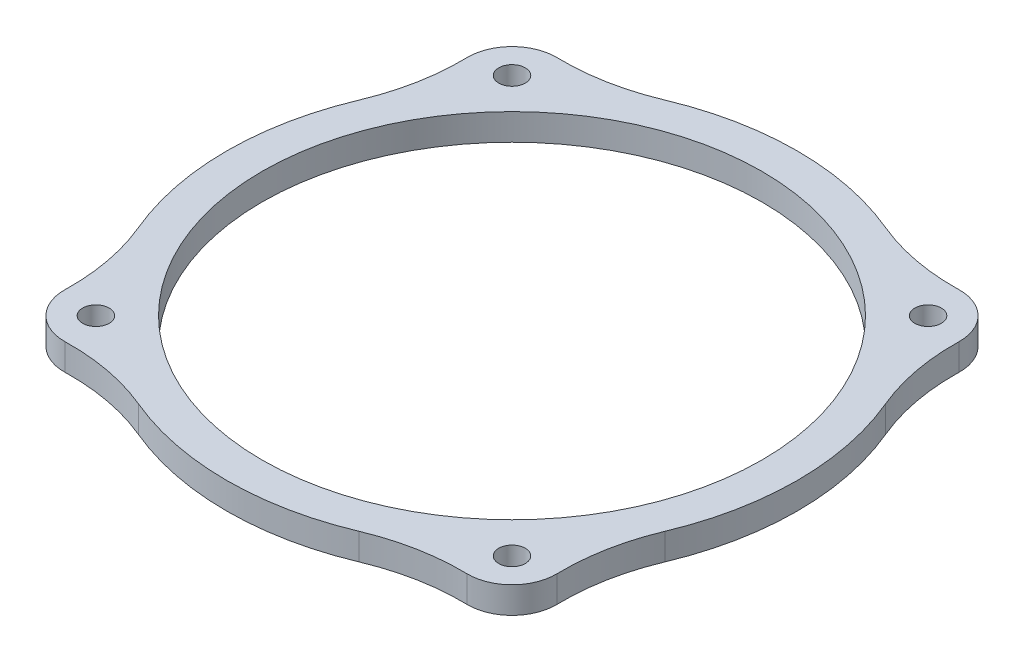
ISO-10303-21;
HEADER;
FILE_DESCRIPTION(('STEP AP214'),'2;1');
FILE_NAME('part.step','',(''),(''),'','','');
FILE_SCHEMA(('AUTOMOTIVE_DESIGN { 1 0 10303 214 1 1 1 1 }'));
ENDSEC;
DATA;
#1=APPLICATION_CONTEXT('core data for automotive mechanical design processes');
#2=APPLICATION_PROTOCOL_DEFINITION('international standard','automotive_design',2000,#1);
#3=PRODUCT_CONTEXT('',#1,'mechanical');
#4=PRODUCT('Part','Part','',(#3));
#5=PRODUCT_RELATED_PRODUCT_CATEGORY('part','',(#4));
#6=PRODUCT_DEFINITION_FORMATION('','',#4);
#7=PRODUCT_DEFINITION_CONTEXT('part definition',#1,'design');
#8=PRODUCT_DEFINITION('design','',#6,#7);
#9=PRODUCT_DEFINITION_SHAPE('','',#8);
#10=(LENGTH_UNIT() NAMED_UNIT(*) SI_UNIT(.MILLI.,.METRE.));
#11=(NAMED_UNIT(*) PLANE_ANGLE_UNIT() SI_UNIT($,.RADIAN.));
#12=(NAMED_UNIT(*) SI_UNIT($,.STERADIAN.) SOLID_ANGLE_UNIT());
#13=UNCERTAINTY_MEASURE_WITH_UNIT(LENGTH_MEASURE(1.E-05),#10,'distance_accuracy_value','');
#14=(GEOMETRIC_REPRESENTATION_CONTEXT(3) GLOBAL_UNCERTAINTY_ASSIGNED_CONTEXT((#13)) GLOBAL_UNIT_ASSIGNED_CONTEXT((#10,
#11,#12)) REPRESENTATION_CONTEXT('',''));
#15=CARTESIAN_POINT('',(0.,0.,0.));
#16=DIRECTION('',(0.,0.,1.));
#17=DIRECTION('',(1.,0.,0.));
#18=AXIS2_PLACEMENT_3D('',#15,#16,#17);
#19=CARTESIAN_POINT('',(-11.4020968466331,3.,-11.402096846633));
#20=DIRECTION('',(0.,1.,0.));
#21=DIRECTION('',(0.,0.,1.));
#22=AXIS2_PLACEMENT_3D('',#19,#20,#21);
#23=PLANE('',#22);
#24=CARTESIAN_POINT('',(-23.5113004744516,3.,23.5113004744538));
#25=DIRECTION('',(0.,1.,0.));
#26=DIRECTION('',(0.,0.,1.));
#27=AXIS2_PLACEMENT_3D('',#24,#25,#26);
#28=CIRCLE('',#27,1.5);
#29=CARTESIAN_POINT('',(-23.5113004744516,3.,25.0113004744538));
#30=VERTEX_POINT('',#29);
#31=EDGE_CURVE('E547',#30,#30,#28,.T.);
#32=ORIENTED_EDGE('',*,*,#31,.F.);
#33=EDGE_LOOP('',(#32));
#34=FACE_BOUND('',#33,.T.);
#35=CARTESIAN_POINT('',(23.5113004744528,3.,-23.5113004744526));
#36=DIRECTION('',(0.,1.,0.));
#37=DIRECTION('',(0.,0.,1.));
#38=AXIS2_PLACEMENT_3D('',#35,#36,#37);
#39=CIRCLE('',#38,1.5);
#40=CARTESIAN_POINT('',(23.5113004744528,3.,-22.0113004744526));
#41=VERTEX_POINT('',#40);
#42=EDGE_CURVE('E295',#41,#41,#39,.T.);
#43=ORIENTED_EDGE('',*,*,#42,.F.);
#44=EDGE_LOOP('',(#43));
#45=FACE_BOUND('',#44,.T.);
#46=CARTESIAN_POINT('',(0.,3.,0.));
#47=DIRECTION('',(0.,1.,0.));
#48=DIRECTION('',(0.,0.,-1.));
#49=AXIS2_PLACEMENT_3D('',#46,#47,#48);
#50=CIRCLE('',#49,32.25);
#51=CARTESIAN_POINT('',(12.4703862032451,3.,-29.7414183915615));
#52=VERTEX_POINT('',#51);
#53=CARTESIAN_POINT('',(-12.4703862032451,3.,-29.7414183915615));
#54=VERTEX_POINT('',#53);
#55=EDGE_CURVE('E195',#52,#54,#50,.T.);
#56=ORIENTED_EDGE('',*,*,#55,.T.);
#57=CARTESIAN_POINT('',(-22.1373522522723,3.,-52.7967814857953));
#58=DIRECTION('',(0.,1.,0.));
#59=DIRECTION('',(0.,0.,1.));
#60=AXIS2_PLACEMENT_3D('',#57,#58,#59);
#61=CIRCLE('',#60,25.);
#62=CARTESIAN_POINT('',(-22.6930534531006,3.,-27.8029583253542));
#63=VERTEX_POINT('',#62);
#64=EDGE_CURVE('E236',#54,#63,#61,.F.);
#65=ORIENTED_EDGE('',*,*,#64,.T.);
#66=CARTESIAN_POINT('',(-22.8041936932663,3.,-22.804193693266));
#67=DIRECTION('',(0.,1.,0.));
#68=DIRECTION('',(0.,0.,1.));
#69=AXIS2_PLACEMENT_3D('',#66,#67,#68);
#70=CIRCLE('',#69,5.);
#71=CARTESIAN_POINT('',(-27.8029583253545,3.,-22.6930534531003));
#72=VERTEX_POINT('',#71);
#73=EDGE_CURVE('E194',#63,#72,#70,.T.);
#74=ORIENTED_EDGE('',*,*,#73,.T.);
#75=CARTESIAN_POINT('',(-52.7967814857955,3.,-22.1373522522718));
#76=DIRECTION('',(0.,1.,0.));
#77=DIRECTION('',(0.,0.,1.));
#78=AXIS2_PLACEMENT_3D('',#75,#76,#77);
#79=CIRCLE('',#78,25.);
#80=CARTESIAN_POINT('',(-29.7414183915616,3.,-12.4703862032448));
#81=VERTEX_POINT('',#80);
#82=EDGE_CURVE('E232',#72,#81,#79,.F.);
#83=ORIENTED_EDGE('',*,*,#82,.T.);
#84=CARTESIAN_POINT('',(0.,3.,0.));
#85=DIRECTION('',(0.,1.,0.));
#86=DIRECTION('',(0.,0.,1.));
#87=AXIS2_PLACEMENT_3D('',#84,#85,#86);
#88=CIRCLE('',#87,32.25);
#89=CARTESIAN_POINT('',(-29.7414183915617,3.,12.4703862032448));
#90=VERTEX_POINT('',#89);
#91=EDGE_CURVE('E274',#81,#90,#88,.T.);
#92=ORIENTED_EDGE('',*,*,#91,.T.);
#93=CARTESIAN_POINT('',(-52.7967814857955,3.,22.1373522522718));
#94=DIRECTION('',(0.,1.,0.));
#95=DIRECTION('',(0.,0.,1.));
#96=AXIS2_PLACEMENT_3D('',#93,#94,#95);
#97=CIRCLE('',#96,25.);
#98=CARTESIAN_POINT('',(-27.8029583253545,3.,22.6930534531003));
#99=VERTEX_POINT('',#98);
#100=EDGE_CURVE('E158',#90,#99,#97,.F.);
#101=ORIENTED_EDGE('',*,*,#100,.T.);
#102=CARTESIAN_POINT('',(-22.8041936932663,3.,22.804193693266));
#103=DIRECTION('',(0.,1.,0.));
#104=DIRECTION('',(0.,0.,-1.));
#105=AXIS2_PLACEMENT_3D('',#102,#103,#104);
#106=CIRCLE('',#105,5.);
#107=CARTESIAN_POINT('',(-22.6930534531006,3.,27.8029583253542));
#108=VERTEX_POINT('',#107);
#109=EDGE_CURVE('E166',#99,#108,#106,.T.);
#110=ORIENTED_EDGE('',*,*,#109,.T.);
#111=CARTESIAN_POINT('',(-22.1373522522723,3.,52.7967814857953));
#112=DIRECTION('',(0.,1.,0.));
#113=DIRECTION('',(0.,0.,1.));
#114=AXIS2_PLACEMENT_3D('',#111,#112,#113);
#115=CIRCLE('',#114,25.);
#116=CARTESIAN_POINT('',(-12.4703862032451,3.,29.7414183915615));
#117=VERTEX_POINT('',#116);
#118=EDGE_CURVE('E11',#108,#117,#115,.F.);
#119=ORIENTED_EDGE('',*,*,#118,.T.);
#120=CARTESIAN_POINT('',(0.,3.,0.));
#121=DIRECTION('',(0.,1.,0.));
#122=DIRECTION('',(0.,0.,1.));
#123=AXIS2_PLACEMENT_3D('',#120,#121,#122);
#124=CIRCLE('',#123,32.25);
#125=CARTESIAN_POINT('',(12.4703862032451,3.,29.7414183915615));
#126=VERTEX_POINT('',#125);
#127=EDGE_CURVE('E260',#117,#126,#124,.T.);
#128=ORIENTED_EDGE('',*,*,#127,.T.);
#129=CARTESIAN_POINT('',(22.1373522522723,3.,52.7967814857953));
#130=DIRECTION('',(0.,1.,0.));
#131=DIRECTION('',(0.,0.,1.));
#132=AXIS2_PLACEMENT_3D('',#129,#130,#131);
#133=CIRCLE('',#132,25.);
#134=CARTESIAN_POINT('',(22.6930534531006,3.,27.8029583253542));
#135=VERTEX_POINT('',#134);
#136=EDGE_CURVE('E252',#126,#135,#133,.F.);
#137=ORIENTED_EDGE('',*,*,#136,.T.);
#138=CARTESIAN_POINT('',(22.8041936932663,3.,22.804193693266));
#139=DIRECTION('',(0.,1.,0.));
#140=DIRECTION('',(0.,0.,1.));
#141=AXIS2_PLACEMENT_3D('',#138,#139,#140);
#142=CIRCLE('',#141,5.);
#143=CARTESIAN_POINT('',(27.8029583253545,3.,22.6930534531003));
#144=VERTEX_POINT('',#143);
#145=EDGE_CURVE('E258',#135,#144,#142,.T.);
#146=ORIENTED_EDGE('',*,*,#145,.T.);
#147=CARTESIAN_POINT('',(52.7967814857955,3.,22.1373522522718));
#148=DIRECTION('',(0.,1.,0.));
#149=DIRECTION('',(0.,0.,1.));
#150=AXIS2_PLACEMENT_3D('',#147,#148,#149);
#151=CIRCLE('',#150,25.);
#152=CARTESIAN_POINT('',(29.7414183915617,3.,12.4703862032448));
#153=VERTEX_POINT('',#152);
#154=EDGE_CURVE('E248',#144,#153,#151,.F.);
#155=ORIENTED_EDGE('',*,*,#154,.T.);
#156=CARTESIAN_POINT('',(0.,3.,0.));
#157=DIRECTION('',(0.,1.,0.));
#158=DIRECTION('',(0.,0.,-1.));
#159=AXIS2_PLACEMENT_3D('',#156,#157,#158);
#160=CIRCLE('',#159,32.25);
#161=CARTESIAN_POINT('',(29.7414183915617,3.,-12.4703862032448));
#162=VERTEX_POINT('',#161);
#163=EDGE_CURVE('E267',#153,#162,#160,.T.);
#164=ORIENTED_EDGE('',*,*,#163,.T.);
#165=CARTESIAN_POINT('',(52.7967814857955,3.,-22.1373522522718));
#166=DIRECTION('',(0.,1.,0.));
#167=DIRECTION('',(0.,0.,1.));
#168=AXIS2_PLACEMENT_3D('',#165,#166,#167);
#169=CIRCLE('',#168,25.);
#170=CARTESIAN_POINT('',(27.8029583253545,3.,-22.6930534531003));
#171=VERTEX_POINT('',#170);
#172=EDGE_CURVE('E244',#162,#171,#169,.F.);
#173=ORIENTED_EDGE('',*,*,#172,.T.);
#174=CARTESIAN_POINT('',(22.8041936932663,3.,-22.804193693266));
#175=DIRECTION('',(0.,1.,0.));
#176=DIRECTION('',(0.,0.,-1.));
#177=AXIS2_PLACEMENT_3D('',#174,#175,#176);
#178=CIRCLE('',#177,5.);
#179=CARTESIAN_POINT('',(22.6930534531006,3.,-27.8029583253542));
#180=VERTEX_POINT('',#179);
#181=EDGE_CURVE('E282',#171,#180,#178,.T.);
#182=ORIENTED_EDGE('',*,*,#181,.T.);
#183=CARTESIAN_POINT('',(22.1373522522723,3.,-52.7967814857953));
#184=DIRECTION('',(0.,1.,0.));
#185=DIRECTION('',(0.,0.,1.));
#186=AXIS2_PLACEMENT_3D('',#183,#184,#185);
#187=CIRCLE('',#186,25.);
#188=EDGE_CURVE('E240',#180,#52,#187,.F.);
#189=ORIENTED_EDGE('',*,*,#188,.T.);
#190=EDGE_LOOP('',(#56,#65,#74,#83,#92,#101,#110,#119,#128,#137,#146,#155,#164,#173,#182,#189));
#191=FACE_BOUND('',#190,.T.);
#192=CARTESIAN_POINT('',(0.,3.,0.));
#193=DIRECTION('',(0.,1.,0.));
#194=DIRECTION('',(0.,0.,1.));
#195=AXIS2_PLACEMENT_3D('',#192,#193,#194);
#196=CIRCLE('',#195,28.25);
#197=CARTESIAN_POINT('',(0.,3.,28.25));
#198=VERTEX_POINT('',#197);
#199=EDGE_CURVE('E286',#198,#198,#196,.T.);
#200=ORIENTED_EDGE('',*,*,#199,.F.);
#201=EDGE_LOOP('',(#200));
#202=FACE_BOUND('',#201,.T.);
#203=CARTESIAN_POINT('',(23.5113004744538,3.,23.5113004744528));
#204=DIRECTION('',(0.,1.,0.));
#205=DIRECTION('',(0.,0.,1.));
#206=AXIS2_PLACEMENT_3D('',#203,#204,#205);
#207=CIRCLE('',#206,1.5);
#208=CARTESIAN_POINT('',(23.5113004744538,3.,25.0113004744528));
#209=VERTEX_POINT('',#208);
#210=EDGE_CURVE('E553',#209,#209,#207,.T.);
#211=ORIENTED_EDGE('',*,*,#210,.F.);
#212=EDGE_LOOP('',(#211));
#213=FACE_BOUND('',#212,.T.);
#214=CARTESIAN_POINT('',(-23.5113004744526,3.,-23.5113004744516));
#215=DIRECTION('',(0.,1.,0.));
#216=DIRECTION('',(0.,0.,1.));
#217=AXIS2_PLACEMENT_3D('',#214,#215,#216);
#218=CIRCLE('',#217,1.5);
#219=CARTESIAN_POINT('',(-23.5113004744526,3.,-22.0113004744516));
#220=VERTEX_POINT('',#219);
#221=EDGE_CURVE('E538',#220,#220,#218,.T.);
#222=ORIENTED_EDGE('',*,*,#221,.F.);
#223=EDGE_LOOP('',(#222));
#224=FACE_BOUND('',#223,.T.);
#225=ADVANCED_FACE('F35',(#34,#45,#191,#202,#213,#224),#23,.T.);
#226=CARTESIAN_POINT('',(-11.4020968466331,0.,-11.402096846633));
#227=DIRECTION('',(0.,1.,0.));
#228=DIRECTION('',(0.,0.,1.));
#229=AXIS2_PLACEMENT_3D('',#226,#227,#228);
#230=PLANE('',#229);
#231=CARTESIAN_POINT('',(-23.5113004744516,0.,23.5113004744538));
#232=DIRECTION('',(0.,1.,0.));
#233=DIRECTION('',(0.,0.,1.));
#234=AXIS2_PLACEMENT_3D('',#231,#232,#233);
#235=CIRCLE('',#234,1.5);
#236=CARTESIAN_POINT('',(-23.5113004744516,0.,25.0113004744538));
#237=VERTEX_POINT('',#236);
#238=EDGE_CURVE('E544',#237,#237,#235,.T.);
#239=ORIENTED_EDGE('',*,*,#238,.T.);
#240=EDGE_LOOP('',(#239));
#241=FACE_BOUND('',#240,.T.);
#242=CARTESIAN_POINT('',(23.5113004744528,0.,-23.5113004744526));
#243=DIRECTION('',(0.,1.,0.));
#244=DIRECTION('',(0.,0.,1.));
#245=AXIS2_PLACEMENT_3D('',#242,#243,#244);
#246=CIRCLE('',#245,1.5);
#247=CARTESIAN_POINT('',(23.5113004744528,0.,-22.0113004744526));
#248=VERTEX_POINT('',#247);
#249=EDGE_CURVE('E298',#248,#248,#246,.T.);
#250=ORIENTED_EDGE('',*,*,#249,.T.);
#251=EDGE_LOOP('',(#250));
#252=FACE_BOUND('',#251,.T.);
#253=CARTESIAN_POINT('',(-22.8041936932663,0.,-22.804193693266));
#254=DIRECTION('',(0.,1.,0.));
#255=DIRECTION('',(0.,0.,1.));
#256=AXIS2_PLACEMENT_3D('',#253,#254,#255);
#257=CIRCLE('',#256,5.);
#258=CARTESIAN_POINT('',(-22.6930534531006,0.,-27.8029583253542));
#259=VERTEX_POINT('',#258);
#260=CARTESIAN_POINT('',(-27.8029583253545,0.,-22.6930534531003));
#261=VERTEX_POINT('',#260);
#262=EDGE_CURVE('E179',#259,#261,#257,.T.);
#263=ORIENTED_EDGE('',*,*,#262,.F.);
#264=CARTESIAN_POINT('',(-22.1373522522723,0.,-52.7967814857953));
#265=DIRECTION('',(0.,1.,0.));
#266=DIRECTION('',(0.,0.,1.));
#267=AXIS2_PLACEMENT_3D('',#264,#265,#266);
#268=CIRCLE('',#267,25.);
#269=CARTESIAN_POINT('',(-12.4703862032451,0.,-29.7414183915615));
#270=VERTEX_POINT('',#269);
#271=EDGE_CURVE('E234',#259,#270,#268,.T.);
#272=ORIENTED_EDGE('',*,*,#271,.T.);
#273=CARTESIAN_POINT('',(0.,0.,0.));
#274=DIRECTION('',(0.,1.,0.));
#275=DIRECTION('',(0.,0.,-1.));
#276=AXIS2_PLACEMENT_3D('',#273,#274,#275);
#277=CIRCLE('',#276,32.25);
#278=CARTESIAN_POINT('',(12.4703862032451,0.,-29.7414183915615));
#279=VERTEX_POINT('',#278);
#280=EDGE_CURVE('E191',#279,#270,#277,.T.);
#281=ORIENTED_EDGE('',*,*,#280,.F.);
#282=CARTESIAN_POINT('',(22.1373522522723,0.,-52.7967814857953));
#283=DIRECTION('',(0.,1.,0.));
#284=DIRECTION('',(0.,0.,1.));
#285=AXIS2_PLACEMENT_3D('',#282,#283,#284);
#286=CIRCLE('',#285,25.);
#287=CARTESIAN_POINT('',(22.6930534531006,0.,-27.8029583253542));
#288=VERTEX_POINT('',#287);
#289=EDGE_CURVE('E238',#279,#288,#286,.T.);
#290=ORIENTED_EDGE('',*,*,#289,.T.);
#291=CARTESIAN_POINT('',(22.8041936932663,0.,-22.804193693266));
#292=DIRECTION('',(0.,1.,0.));
#293=DIRECTION('',(0.,0.,-1.));
#294=AXIS2_PLACEMENT_3D('',#291,#292,#293);
#295=CIRCLE('',#294,5.);
#296=CARTESIAN_POINT('',(27.8029583253545,0.,-22.6930534531003));
#297=VERTEX_POINT('',#296);
#298=EDGE_CURVE('E188',#297,#288,#295,.T.);
#299=ORIENTED_EDGE('',*,*,#298,.F.);
#300=CARTESIAN_POINT('',(52.7967814857955,0.,-22.1373522522718));
#301=DIRECTION('',(0.,1.,0.));
#302=DIRECTION('',(0.,0.,1.));
#303=AXIS2_PLACEMENT_3D('',#300,#301,#302);
#304=CIRCLE('',#303,25.);
#305=CARTESIAN_POINT('',(29.7414183915617,0.,-12.4703862032448));
#306=VERTEX_POINT('',#305);
#307=EDGE_CURVE('E242',#297,#306,#304,.T.);
#308=ORIENTED_EDGE('',*,*,#307,.T.);
#309=CARTESIAN_POINT('',(0.,0.,0.));
#310=DIRECTION('',(0.,1.,0.));
#311=DIRECTION('',(0.,0.,-1.));
#312=AXIS2_PLACEMENT_3D('',#309,#310,#311);
#313=CIRCLE('',#312,32.25);
#314=CARTESIAN_POINT('',(29.7414183915617,0.,12.4703862032448));
#315=VERTEX_POINT('',#314);
#316=EDGE_CURVE('E185',#315,#306,#313,.T.);
#317=ORIENTED_EDGE('',*,*,#316,.F.);
#318=CARTESIAN_POINT('',(52.7967814857955,0.,22.1373522522718));
#319=DIRECTION('',(0.,1.,0.));
#320=DIRECTION('',(0.,0.,1.));
#321=AXIS2_PLACEMENT_3D('',#318,#319,#320);
#322=CIRCLE('',#321,25.);
#323=CARTESIAN_POINT('',(27.8029583253545,0.,22.6930534531003));
#324=VERTEX_POINT('',#323);
#325=EDGE_CURVE('E246',#315,#324,#322,.T.);
#326=ORIENTED_EDGE('',*,*,#325,.T.);
#327=CARTESIAN_POINT('',(22.8041936932663,0.,22.804193693266));
#328=DIRECTION('',(0.,1.,0.));
#329=DIRECTION('',(0.,0.,1.));
#330=AXIS2_PLACEMENT_3D('',#327,#328,#329);
#331=CIRCLE('',#330,5.);
#332=CARTESIAN_POINT('',(22.6930534531006,0.,27.8029583253542));
#333=VERTEX_POINT('',#332);
#334=EDGE_CURVE('E177',#333,#324,#331,.T.);
#335=ORIENTED_EDGE('',*,*,#334,.F.);
#336=CARTESIAN_POINT('',(22.1373522522723,0.,52.7967814857953));
#337=DIRECTION('',(0.,1.,0.));
#338=DIRECTION('',(0.,0.,1.));
#339=AXIS2_PLACEMENT_3D('',#336,#337,#338);
#340=CIRCLE('',#339,25.);
#341=CARTESIAN_POINT('',(12.4703862032451,0.,29.7414183915615));
#342=VERTEX_POINT('',#341);
#343=EDGE_CURVE('E250',#333,#342,#340,.T.);
#344=ORIENTED_EDGE('',*,*,#343,.T.);
#345=CARTESIAN_POINT('',(0.,0.,0.));
#346=DIRECTION('',(0.,1.,0.));
#347=DIRECTION('',(0.,0.,1.));
#348=AXIS2_PLACEMENT_3D('',#345,#346,#347);
#349=CIRCLE('',#348,32.25);
#350=CARTESIAN_POINT('',(-12.4703862032451,0.,29.7414183915615));
#351=VERTEX_POINT('',#350);
#352=EDGE_CURVE('E174',#351,#342,#349,.T.);
#353=ORIENTED_EDGE('',*,*,#352,.F.);
#354=CARTESIAN_POINT('',(-22.1373522522723,0.,52.7967814857953));
#355=DIRECTION('',(0.,1.,0.));
#356=DIRECTION('',(0.,0.,1.));
#357=AXIS2_PLACEMENT_3D('',#354,#355,#356);
#358=CIRCLE('',#357,25.);
#359=CARTESIAN_POINT('',(-22.6930534531006,0.,27.8029583253542));
#360=VERTEX_POINT('',#359);
#361=EDGE_CURVE('E43',#351,#360,#358,.T.);
#362=ORIENTED_EDGE('',*,*,#361,.T.);
#363=CARTESIAN_POINT('',(-22.8041936932663,0.,22.804193693266));
#364=DIRECTION('',(0.,1.,0.));
#365=DIRECTION('',(0.,0.,-1.));
#366=AXIS2_PLACEMENT_3D('',#363,#364,#365);
#367=CIRCLE('',#366,5.);
#368=CARTESIAN_POINT('',(-27.8029583253545,0.,22.6930534531003));
#369=VERTEX_POINT('',#368);
#370=EDGE_CURVE('E164',#369,#360,#367,.T.);
#371=ORIENTED_EDGE('',*,*,#370,.F.);
#372=CARTESIAN_POINT('',(-52.7967814857955,0.,22.1373522522718));
#373=DIRECTION('',(0.,1.,0.));
#374=DIRECTION('',(0.,0.,1.));
#375=AXIS2_PLACEMENT_3D('',#372,#373,#374);
#376=CIRCLE('',#375,25.);
#377=CARTESIAN_POINT('',(-29.7414183915617,0.,12.4703862032448));
#378=VERTEX_POINT('',#377);
#379=EDGE_CURVE('E148',#369,#378,#376,.T.);
#380=ORIENTED_EDGE('',*,*,#379,.T.);
#381=CARTESIAN_POINT('',(0.,0.,0.));
#382=DIRECTION('',(0.,1.,0.));
#383=DIRECTION('',(0.,0.,1.));
#384=AXIS2_PLACEMENT_3D('',#381,#382,#383);
#385=CIRCLE('',#384,32.25);
#386=CARTESIAN_POINT('',(-29.7414183915616,0.,-12.4703862032448));
#387=VERTEX_POINT('',#386);
#388=EDGE_CURVE('E175',#387,#378,#385,.T.);
#389=ORIENTED_EDGE('',*,*,#388,.F.);
#390=CARTESIAN_POINT('',(-52.7967814857955,0.,-22.1373522522718));
#391=DIRECTION('',(0.,1.,0.));
#392=DIRECTION('',(0.,0.,1.));
#393=AXIS2_PLACEMENT_3D('',#390,#391,#392);
#394=CIRCLE('',#393,25.);
#395=EDGE_CURVE('E230',#387,#261,#394,.T.);
#396=ORIENTED_EDGE('',*,*,#395,.T.);
#397=EDGE_LOOP('',(#263,#272,#281,#290,#299,#308,#317,#326,#335,#344,#353,#362,#371,#380,#389,#396));
#398=FACE_BOUND('',#397,.T.);
#399=CARTESIAN_POINT('',(0.,0.,0.));
#400=DIRECTION('',(0.,1.,0.));
#401=DIRECTION('',(0.,0.,1.));
#402=AXIS2_PLACEMENT_3D('',#399,#400,#401);
#403=CIRCLE('',#402,28.25);
#404=CARTESIAN_POINT('',(0.,0.,28.25));
#405=VERTEX_POINT('',#404);
#406=EDGE_CURVE('E290',#405,#405,#403,.T.);
#407=ORIENTED_EDGE('',*,*,#406,.T.);
#408=EDGE_LOOP('',(#407));
#409=FACE_BOUND('',#408,.T.);
#410=CARTESIAN_POINT('',(23.5113004744538,0.,23.5113004744528));
#411=DIRECTION('',(0.,1.,0.));
#412=DIRECTION('',(0.,0.,1.));
#413=AXIS2_PLACEMENT_3D('',#410,#411,#412);
#414=CIRCLE('',#413,1.5);
#415=CARTESIAN_POINT('',(23.5113004744538,0.,25.0113004744528));
#416=VERTEX_POINT('',#415);
#417=EDGE_CURVE('E550',#416,#416,#414,.T.);
#418=ORIENTED_EDGE('',*,*,#417,.T.);
#419=EDGE_LOOP('',(#418));
#420=FACE_BOUND('',#419,.T.);
#421=CARTESIAN_POINT('',(-23.5113004744526,0.,-23.5113004744516));
#422=DIRECTION('',(0.,1.,0.));
#423=DIRECTION('',(0.,0.,1.));
#424=AXIS2_PLACEMENT_3D('',#421,#422,#423);
#425=CIRCLE('',#424,1.5);
#426=CARTESIAN_POINT('',(-23.5113004744526,0.,-22.0113004744516));
#427=VERTEX_POINT('',#426);
#428=EDGE_CURVE('E541',#427,#427,#425,.T.);
#429=ORIENTED_EDGE('',*,*,#428,.T.);
#430=EDGE_LOOP('',(#429));
#431=FACE_BOUND('',#430,.T.);
#432=ADVANCED_FACE('F171',(#241,#252,#398,#409,#420,#431),#230,.F.);
#433=CARTESIAN_POINT('',(-22.8041936932663,3.,-22.804193693266));
#434=DIRECTION('',(0.,-1.,0.));
#435=DIRECTION('',(0.,0.,-1.));
#436=AXIS2_PLACEMENT_3D('',#433,#434,#435);
#437=CYLINDRICAL_SURFACE('',#436,5.);
#438=ORIENTED_EDGE('',*,*,#262,.T.);
#439=DIRECTION('',(0.,-1.,0.));
#440=VECTOR('',#439,1.);
#441=CARTESIAN_POINT('',(-27.8029583253545,3.,-22.6930534531003));
#442=LINE('',#441,#440);
#443=EDGE_CURVE('E203',#261,#72,#442,.F.);
#444=ORIENTED_EDGE('',*,*,#443,.T.);
#445=ORIENTED_EDGE('',*,*,#73,.F.);
#446=DIRECTION('',(0.,-1.,0.));
#447=VECTOR('',#446,1.);
#448=CARTESIAN_POINT('',(-22.6930534531006,3.,-27.8029583253542));
#449=LINE('',#448,#447);
#450=EDGE_CURVE('E200',#63,#259,#449,.T.);
#451=ORIENTED_EDGE('',*,*,#450,.T.);
#452=EDGE_LOOP('',(#438,#444,#445,#451));
#453=FACE_BOUND('',#452,.T.);
#454=ADVANCED_FACE('F319',(#453),#437,.T.);
#455=CARTESIAN_POINT('',(0.,3.,0.));
#456=DIRECTION('',(0.,-1.,0.));
#457=DIRECTION('',(0.,0.,-1.));
#458=AXIS2_PLACEMENT_3D('',#455,#456,#457);
#459=CYLINDRICAL_SURFACE('',#458,32.25);
#460=ORIENTED_EDGE('',*,*,#388,.T.);
#461=DIRECTION('',(0.,-1.,0.));
#462=VECTOR('',#461,1.);
#463=CARTESIAN_POINT('',(-29.7414183915617,3.,12.4703862032448));
#464=LINE('',#463,#462);
#465=EDGE_CURVE('E153',#378,#90,#464,.F.);
#466=ORIENTED_EDGE('',*,*,#465,.T.);
#467=ORIENTED_EDGE('',*,*,#91,.F.);
#468=DIRECTION('',(0.,-1.,0.));
#469=VECTOR('',#468,1.);
#470=CARTESIAN_POINT('',(-29.7414183915617,3.,-12.4703862032448));
#471=LINE('',#470,#469);
#472=EDGE_CURVE('E167',#81,#387,#471,.T.);
#473=ORIENTED_EDGE('',*,*,#472,.T.);
#474=EDGE_LOOP('',(#460,#466,#467,#473));
#475=FACE_BOUND('',#474,.T.);
#476=ADVANCED_FACE('F310',(#475),#459,.T.);
#477=CARTESIAN_POINT('',(-22.8041936932663,3.,22.804193693266));
#478=DIRECTION('',(0.,-1.,0.));
#479=DIRECTION('',(0.,0.,-1.));
#480=AXIS2_PLACEMENT_3D('',#477,#478,#479);
#481=CYLINDRICAL_SURFACE('',#480,5.);
#482=ORIENTED_EDGE('',*,*,#109,.F.);
#483=DIRECTION('',(0.,-1.,0.));
#484=VECTOR('',#483,1.);
#485=CARTESIAN_POINT('',(-27.8029583253545,3.,22.6930534531003));
#486=LINE('',#485,#484);
#487=EDGE_CURVE('E152',#99,#369,#486,.T.);
#488=ORIENTED_EDGE('',*,*,#487,.T.);
#489=ORIENTED_EDGE('',*,*,#370,.T.);
#490=DIRECTION('',(0.,-1.,0.));
#491=VECTOR('',#490,1.);
#492=CARTESIAN_POINT('',(-22.6930534531006,3.,27.8029583253542));
#493=LINE('',#492,#491);
#494=EDGE_CURVE('E168',#360,#108,#493,.F.);
#495=ORIENTED_EDGE('',*,*,#494,.T.);
#496=EDGE_LOOP('',(#482,#488,#489,#495));
#497=FACE_BOUND('',#496,.T.);
#498=ADVANCED_FACE('F163',(#497),#481,.T.);
#499=CARTESIAN_POINT('',(0.,3.,0.));
#500=DIRECTION('',(0.,-1.,0.));
#501=DIRECTION('',(0.,0.,-1.));
#502=AXIS2_PLACEMENT_3D('',#499,#500,#501);
#503=CYLINDRICAL_SURFACE('',#502,32.25);
#504=ORIENTED_EDGE('',*,*,#352,.T.);
#505=DIRECTION('',(0.,-1.,0.));
#506=VECTOR('',#505,1.);
#507=CARTESIAN_POINT('',(12.4703862032451,3.,29.7414183915615));
#508=LINE('',#507,#506);
#509=EDGE_CURVE('E50',#342,#126,#508,.F.);
#510=ORIENTED_EDGE('',*,*,#509,.T.);
#511=ORIENTED_EDGE('',*,*,#127,.F.);
#512=DIRECTION('',(0.,-1.,0.));
#513=VECTOR('',#512,1.);
#514=CARTESIAN_POINT('',(-12.4703862032451,3.,29.7414183915615));
#515=LINE('',#514,#513);
#516=EDGE_CURVE('E225',#117,#351,#515,.T.);
#517=ORIENTED_EDGE('',*,*,#516,.T.);
#518=EDGE_LOOP('',(#504,#510,#511,#517));
#519=FACE_BOUND('',#518,.T.);
#520=ADVANCED_FACE('F270',(#519),#503,.T.);
#521=CARTESIAN_POINT('',(22.8041936932663,3.,22.804193693266));
#522=DIRECTION('',(0.,-1.,0.));
#523=DIRECTION('',(0.,0.,-1.));
#524=AXIS2_PLACEMENT_3D('',#521,#522,#523);
#525=CYLINDRICAL_SURFACE('',#524,5.);
#526=ORIENTED_EDGE('',*,*,#334,.T.);
#527=DIRECTION('',(0.,-1.,0.));
#528=VECTOR('',#527,1.);
#529=CARTESIAN_POINT('',(27.8029583253545,3.,22.6930534531003));
#530=LINE('',#529,#528);
#531=EDGE_CURVE('E223',#324,#144,#530,.F.);
#532=ORIENTED_EDGE('',*,*,#531,.T.);
#533=ORIENTED_EDGE('',*,*,#145,.F.);
#534=DIRECTION('',(0.,-1.,0.));
#535=VECTOR('',#534,1.);
#536=CARTESIAN_POINT('',(22.6930534531006,3.,27.8029583253542));
#537=LINE('',#536,#535);
#538=EDGE_CURVE('E220',#135,#333,#537,.T.);
#539=ORIENTED_EDGE('',*,*,#538,.T.);
#540=EDGE_LOOP('',(#526,#532,#533,#539));
#541=FACE_BOUND('',#540,.T.);
#542=ADVANCED_FACE('F264',(#541),#525,.T.);
#543=CARTESIAN_POINT('',(0.,3.,0.));
#544=DIRECTION('',(0.,-1.,0.));
#545=DIRECTION('',(0.,0.,-1.));
#546=AXIS2_PLACEMENT_3D('',#543,#544,#545);
#547=CYLINDRICAL_SURFACE('',#546,32.25);
#548=ORIENTED_EDGE('',*,*,#316,.T.);
#549=DIRECTION('',(0.,-1.,0.));
#550=VECTOR('',#549,1.);
#551=CARTESIAN_POINT('',(29.7414183915617,3.,-12.4703862032448));
#552=LINE('',#551,#550);
#553=EDGE_CURVE('E218',#306,#162,#552,.F.);
#554=ORIENTED_EDGE('',*,*,#553,.T.);
#555=ORIENTED_EDGE('',*,*,#163,.F.);
#556=DIRECTION('',(0.,-1.,0.));
#557=VECTOR('',#556,1.);
#558=CARTESIAN_POINT('',(29.7414183915617,3.,12.4703862032448));
#559=LINE('',#558,#557);
#560=EDGE_CURVE('E215',#153,#315,#559,.T.);
#561=ORIENTED_EDGE('',*,*,#560,.T.);
#562=EDGE_LOOP('',(#548,#554,#555,#561));
#563=FACE_BOUND('',#562,.T.);
#564=ADVANCED_FACE('F346',(#563),#547,.T.);
#565=CARTESIAN_POINT('',(22.8041936932663,3.,-22.804193693266));
#566=DIRECTION('',(0.,-1.,0.));
#567=DIRECTION('',(0.,0.,-1.));
#568=AXIS2_PLACEMENT_3D('',#565,#566,#567);
#569=CYLINDRICAL_SURFACE('',#568,5.);
#570=ORIENTED_EDGE('',*,*,#298,.T.);
#571=DIRECTION('',(0.,-1.,0.));
#572=VECTOR('',#571,1.);
#573=CARTESIAN_POINT('',(22.6930534531006,3.,-27.8029583253542));
#574=LINE('',#573,#572);
#575=EDGE_CURVE('E213',#288,#180,#574,.F.);
#576=ORIENTED_EDGE('',*,*,#575,.T.);
#577=ORIENTED_EDGE('',*,*,#181,.F.);
#578=DIRECTION('',(0.,-1.,0.));
#579=VECTOR('',#578,1.);
#580=CARTESIAN_POINT('',(27.8029583253545,3.,-22.6930534531003));
#581=LINE('',#580,#579);
#582=EDGE_CURVE('E210',#171,#297,#581,.T.);
#583=ORIENTED_EDGE('',*,*,#582,.T.);
#584=EDGE_LOOP('',(#570,#576,#577,#583));
#585=FACE_BOUND('',#584,.T.);
#586=ADVANCED_FACE('F343',(#585),#569,.T.);
#587=CARTESIAN_POINT('',(0.,3.,0.));
#588=DIRECTION('',(0.,-1.,0.));
#589=DIRECTION('',(0.,0.,-1.));
#590=AXIS2_PLACEMENT_3D('',#587,#588,#589);
#591=CYLINDRICAL_SURFACE('',#590,32.25);
#592=ORIENTED_EDGE('',*,*,#280,.T.);
#593=DIRECTION('',(0.,-1.,0.));
#594=VECTOR('',#593,1.);
#595=CARTESIAN_POINT('',(-12.4703862032451,3.,-29.7414183915615));
#596=LINE('',#595,#594);
#597=EDGE_CURVE('E208',#270,#54,#596,.F.);
#598=ORIENTED_EDGE('',*,*,#597,.T.);
#599=ORIENTED_EDGE('',*,*,#55,.F.);
#600=DIRECTION('',(0.,-1.,0.));
#601=VECTOR('',#600,1.);
#602=CARTESIAN_POINT('',(12.4703862032451,3.,-29.7414183915615));
#603=LINE('',#602,#601);
#604=EDGE_CURVE('E205',#52,#279,#603,.T.);
#605=ORIENTED_EDGE('',*,*,#604,.T.);
#606=EDGE_LOOP('',(#592,#598,#599,#605));
#607=FACE_BOUND('',#606,.T.);
#608=ADVANCED_FACE('F315',(#607),#591,.T.);
#609=CARTESIAN_POINT('',(0.,3.,0.));
#610=DIRECTION('',(0.,-1.,0.));
#611=DIRECTION('',(0.,0.,-1.));
#612=AXIS2_PLACEMENT_3D('',#609,#610,#611);
#613=CYLINDRICAL_SURFACE('',#612,28.25);
#614=ORIENTED_EDGE('',*,*,#199,.T.);
#615=EDGE_LOOP('',(#614));
#616=FACE_BOUND('',#615,.T.);
#617=ORIENTED_EDGE('',*,*,#406,.F.);
#618=EDGE_LOOP('',(#617));
#619=FACE_BOUND('',#618,.T.);
#620=ADVANCED_FACE('F338',(#616,#619),#613,.F.);
#621=CARTESIAN_POINT('',(23.5113004744528,3.,-23.5113004744526));
#622=DIRECTION('',(0.,-1.,0.));
#623=DIRECTION('',(0.,0.,-1.));
#624=AXIS2_PLACEMENT_3D('',#621,#622,#623);
#625=CYLINDRICAL_SURFACE('',#624,1.5);
#626=ORIENTED_EDGE('',*,*,#42,.T.);
#627=EDGE_LOOP('',(#626));
#628=FACE_BOUND('',#627,.T.);
#629=ORIENTED_EDGE('',*,*,#249,.F.);
#630=EDGE_LOOP('',(#629));
#631=FACE_BOUND('',#630,.T.);
#632=ADVANCED_FACE('F387',(#628,#631),#625,.F.);
#633=CARTESIAN_POINT('',(23.5113004744538,3.,23.5113004744528));
#634=DIRECTION('',(0.,-1.,0.));
#635=DIRECTION('',(0.,0.,-1.));
#636=AXIS2_PLACEMENT_3D('',#633,#634,#635);
#637=CYLINDRICAL_SURFACE('',#636,1.5);
#638=ORIENTED_EDGE('',*,*,#210,.T.);
#639=EDGE_LOOP('',(#638));
#640=FACE_BOUND('',#639,.T.);
#641=ORIENTED_EDGE('',*,*,#417,.F.);
#642=EDGE_LOOP('',(#641));
#643=FACE_BOUND('',#642,.T.);
#644=ADVANCED_FACE('F393',(#640,#643),#637,.F.);
#645=CARTESIAN_POINT('',(-23.5113004744516,3.,23.5113004744538));
#646=DIRECTION('',(0.,-1.,0.));
#647=DIRECTION('',(0.,0.,-1.));
#648=AXIS2_PLACEMENT_3D('',#645,#646,#647);
#649=CYLINDRICAL_SURFACE('',#648,1.5);
#650=ORIENTED_EDGE('',*,*,#31,.T.);
#651=EDGE_LOOP('',(#650));
#652=FACE_BOUND('',#651,.T.);
#653=ORIENTED_EDGE('',*,*,#238,.F.);
#654=EDGE_LOOP('',(#653));
#655=FACE_BOUND('',#654,.T.);
#656=ADVANCED_FACE('F400',(#652,#655),#649,.F.);
#657=CARTESIAN_POINT('',(-23.5113004744526,3.,-23.5113004744516));
#658=DIRECTION('',(0.,-1.,0.));
#659=DIRECTION('',(0.,0.,-1.));
#660=AXIS2_PLACEMENT_3D('',#657,#658,#659);
#661=CYLINDRICAL_SURFACE('',#660,1.5);
#662=ORIENTED_EDGE('',*,*,#221,.T.);
#663=EDGE_LOOP('',(#662));
#664=FACE_BOUND('',#663,.T.);
#665=ORIENTED_EDGE('',*,*,#428,.F.);
#666=EDGE_LOOP('',(#665));
#667=FACE_BOUND('',#666,.T.);
#668=ADVANCED_FACE('F408',(#664,#667),#661,.F.);
#669=CARTESIAN_POINT('',(-52.7967814857955,3.,22.1373522522718));
#670=DIRECTION('',(0.,1.,0.));
#671=DIRECTION('',(0.,0.,1.));
#672=AXIS2_PLACEMENT_3D('',#669,#670,#671);
#673=CYLINDRICAL_SURFACE('',#672,25.);
#674=ORIENTED_EDGE('',*,*,#100,.F.);
#675=ORIENTED_EDGE('',*,*,#465,.F.);
#676=ORIENTED_EDGE('',*,*,#379,.F.);
#677=ORIENTED_EDGE('',*,*,#487,.F.);
#678=EDGE_LOOP('',(#674,#675,#676,#677));
#679=FACE_BOUND('',#678,.T.);
#680=ADVANCED_FACE('F151',(#679),#673,.F.);
#681=CARTESIAN_POINT('',(-52.7967814857955,3.,-22.1373522522718));
#682=DIRECTION('',(0.,1.,0.));
#683=DIRECTION('',(0.,0.,1.));
#684=AXIS2_PLACEMENT_3D('',#681,#682,#683);
#685=CYLINDRICAL_SURFACE('',#684,25.);
#686=ORIENTED_EDGE('',*,*,#82,.F.);
#687=ORIENTED_EDGE('',*,*,#443,.F.);
#688=ORIENTED_EDGE('',*,*,#395,.F.);
#689=ORIENTED_EDGE('',*,*,#472,.F.);
#690=EDGE_LOOP('',(#686,#687,#688,#689));
#691=FACE_BOUND('',#690,.T.);
#692=ADVANCED_FACE('F308',(#691),#685,.F.);
#693=CARTESIAN_POINT('',(-22.1373522522723,3.,-52.7967814857953));
#694=DIRECTION('',(0.,1.,0.));
#695=DIRECTION('',(0.,0.,1.));
#696=AXIS2_PLACEMENT_3D('',#693,#694,#695);
#697=CYLINDRICAL_SURFACE('',#696,25.);
#698=ORIENTED_EDGE('',*,*,#64,.F.);
#699=ORIENTED_EDGE('',*,*,#597,.F.);
#700=ORIENTED_EDGE('',*,*,#271,.F.);
#701=ORIENTED_EDGE('',*,*,#450,.F.);
#702=EDGE_LOOP('',(#698,#699,#700,#701));
#703=FACE_BOUND('',#702,.T.);
#704=ADVANCED_FACE('F318',(#703),#697,.F.);
#705=CARTESIAN_POINT('',(22.1373522522723,3.,-52.7967814857953));
#706=DIRECTION('',(0.,1.,0.));
#707=DIRECTION('',(0.,0.,1.));
#708=AXIS2_PLACEMENT_3D('',#705,#706,#707);
#709=CYLINDRICAL_SURFACE('',#708,25.);
#710=ORIENTED_EDGE('',*,*,#188,.F.);
#711=ORIENTED_EDGE('',*,*,#575,.F.);
#712=ORIENTED_EDGE('',*,*,#289,.F.);
#713=ORIENTED_EDGE('',*,*,#604,.F.);
#714=EDGE_LOOP('',(#710,#711,#712,#713));
#715=FACE_BOUND('',#714,.T.);
#716=ADVANCED_FACE('F433',(#715),#709,.F.);
#717=CARTESIAN_POINT('',(52.7967814857955,3.,-22.1373522522718));
#718=DIRECTION('',(0.,1.,0.));
#719=DIRECTION('',(0.,0.,1.));
#720=AXIS2_PLACEMENT_3D('',#717,#718,#719);
#721=CYLINDRICAL_SURFACE('',#720,25.);
#722=ORIENTED_EDGE('',*,*,#172,.F.);
#723=ORIENTED_EDGE('',*,*,#553,.F.);
#724=ORIENTED_EDGE('',*,*,#307,.F.);
#725=ORIENTED_EDGE('',*,*,#582,.F.);
#726=EDGE_LOOP('',(#722,#723,#724,#725));
#727=FACE_BOUND('',#726,.T.);
#728=ADVANCED_FACE('F440',(#727),#721,.F.);
#729=CARTESIAN_POINT('',(52.7967814857955,3.,22.1373522522718));
#730=DIRECTION('',(0.,1.,0.));
#731=DIRECTION('',(0.,0.,1.));
#732=AXIS2_PLACEMENT_3D('',#729,#730,#731);
#733=CYLINDRICAL_SURFACE('',#732,25.);
#734=ORIENTED_EDGE('',*,*,#154,.F.);
#735=ORIENTED_EDGE('',*,*,#531,.F.);
#736=ORIENTED_EDGE('',*,*,#325,.F.);
#737=ORIENTED_EDGE('',*,*,#560,.F.);
#738=EDGE_LOOP('',(#734,#735,#736,#737));
#739=FACE_BOUND('',#738,.T.);
#740=ADVANCED_FACE('F448',(#739),#733,.F.);
#741=CARTESIAN_POINT('',(22.1373522522723,3.,52.7967814857953));
#742=DIRECTION('',(0.,1.,0.));
#743=DIRECTION('',(0.,0.,1.));
#744=AXIS2_PLACEMENT_3D('',#741,#742,#743);
#745=CYLINDRICAL_SURFACE('',#744,25.);
#746=ORIENTED_EDGE('',*,*,#136,.F.);
#747=ORIENTED_EDGE('',*,*,#509,.F.);
#748=ORIENTED_EDGE('',*,*,#343,.F.);
#749=ORIENTED_EDGE('',*,*,#538,.F.);
#750=EDGE_LOOP('',(#746,#747,#748,#749));
#751=FACE_BOUND('',#750,.T.);
#752=ADVANCED_FACE('F269',(#751),#745,.F.);
#753=CARTESIAN_POINT('',(-22.1373522522723,3.,52.7967814857953));
#754=DIRECTION('',(0.,1.,0.));
#755=DIRECTION('',(0.,0.,1.));
#756=AXIS2_PLACEMENT_3D('',#753,#754,#755);
#757=CYLINDRICAL_SURFACE('',#756,25.);
#758=ORIENTED_EDGE('',*,*,#118,.F.);
#759=ORIENTED_EDGE('',*,*,#494,.F.);
#760=ORIENTED_EDGE('',*,*,#361,.F.);
#761=ORIENTED_EDGE('',*,*,#516,.F.);
#762=EDGE_LOOP('',(#758,#759,#760,#761));
#763=FACE_BOUND('',#762,.T.);
#764=ADVANCED_FACE('F37',(#763),#757,.F.);
#765=CLOSED_SHELL('',(#225,#432,#454,#476,#498,#520,#542,#564,#586,#608,#620,#632,#644,#656,
#668,#680,#692,#704,#716,#728,#740,#752,#764));
#766=MANIFOLD_SOLID_BREP('B2',#765);
#767=ADVANCED_BREP_SHAPE_REPRESENTATION('',(#18,#766),#14);
#768=SHAPE_DEFINITION_REPRESENTATION(#9,#767);
ENDSEC;
END-ISO-10303-21;
